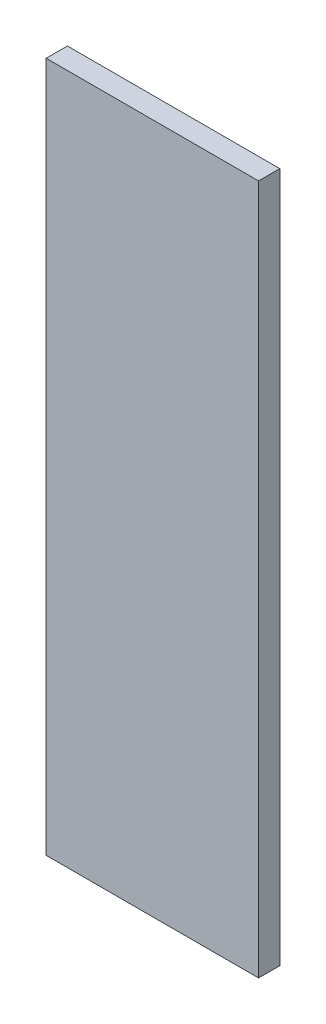
ISO-10303-21;
HEADER;
FILE_DESCRIPTION(('STEP AP214'),'2;1');
FILE_NAME('part.step','',(''),(''),'','','');
FILE_SCHEMA(('AUTOMOTIVE_DESIGN { 1 0 10303 214 1 1 1 1 }'));
ENDSEC;
DATA;
#1=APPLICATION_CONTEXT('core data for automotive mechanical design processes');
#2=APPLICATION_PROTOCOL_DEFINITION('international standard','automotive_design',2000,#1);
#3=PRODUCT_CONTEXT('',#1,'mechanical');
#4=PRODUCT('Part','Part','',(#3));
#5=PRODUCT_RELATED_PRODUCT_CATEGORY('part','',(#4));
#6=PRODUCT_DEFINITION_FORMATION('','',#4);
#7=PRODUCT_DEFINITION_CONTEXT('part definition',#1,'design');
#8=PRODUCT_DEFINITION('design','',#6,#7);
#9=PRODUCT_DEFINITION_SHAPE('','',#8);
#10=(LENGTH_UNIT() NAMED_UNIT(*) SI_UNIT(.MILLI.,.METRE.));
#11=(NAMED_UNIT(*) PLANE_ANGLE_UNIT() SI_UNIT($,.RADIAN.));
#12=(NAMED_UNIT(*) SI_UNIT($,.STERADIAN.) SOLID_ANGLE_UNIT());
#13=UNCERTAINTY_MEASURE_WITH_UNIT(LENGTH_MEASURE(1.E-05),#10,'distance_accuracy_value','');
#14=(GEOMETRIC_REPRESENTATION_CONTEXT(3) GLOBAL_UNCERTAINTY_ASSIGNED_CONTEXT((#13)) GLOBAL_UNIT_ASSIGNED_CONTEXT((#10,
#11,#12)) REPRESENTATION_CONTEXT('',''));
#15=CARTESIAN_POINT('',(0.,0.,0.));
#16=DIRECTION('',(0.,0.,1.));
#17=DIRECTION('',(1.,0.,0.));
#18=AXIS2_PLACEMENT_3D('',#15,#16,#17);
#19=CARTESIAN_POINT('',(40.,-130.,8.));
#20=DIRECTION('',(-1.,0.,0.));
#21=DIRECTION('',(0.,0.,1.));
#22=AXIS2_PLACEMENT_3D('',#19,#20,#21);
#23=PLANE('',#22);
#24=DIRECTION('',(0.,1.,0.));
#25=VECTOR('',#24,1.);
#26=CARTESIAN_POINT('',(40.,-130.,0.));
#27=LINE('',#26,#25);
#28=CARTESIAN_POINT('',(40.,-130.,0.));
#29=VERTEX_POINT('',#28);
#30=CARTESIAN_POINT('',(40.,130.,0.));
#31=VERTEX_POINT('',#30);
#32=EDGE_CURVE('E100',#29,#31,#27,.T.);
#33=ORIENTED_EDGE('',*,*,#32,.T.);
#34=DIRECTION('',(0.,0.,-1.));
#35=VECTOR('',#34,1.);
#36=CARTESIAN_POINT('',(40.,130.,8.));
#37=LINE('',#36,#35);
#38=CARTESIAN_POINT('',(40.,130.,8.));
#39=VERTEX_POINT('',#38);
#40=EDGE_CURVE('E11',#39,#31,#37,.T.);
#41=ORIENTED_EDGE('',*,*,#40,.F.);
#42=DIRECTION('',(0.,1.,0.));
#43=VECTOR('',#42,1.);
#44=CARTESIAN_POINT('',(40.,-130.,8.));
#45=LINE('',#44,#43);
#46=CARTESIAN_POINT('',(40.,-130.,8.));
#47=VERTEX_POINT('',#46);
#48=EDGE_CURVE('E88',#47,#39,#45,.T.);
#49=ORIENTED_EDGE('',*,*,#48,.F.);
#50=DIRECTION('',(0.,0.,-1.));
#51=VECTOR('',#50,1.);
#52=CARTESIAN_POINT('',(40.,-130.,8.));
#53=LINE('',#52,#51);
#54=EDGE_CURVE('E96',#47,#29,#53,.T.);
#55=ORIENTED_EDGE('',*,*,#54,.T.);
#56=EDGE_LOOP('',(#33,#41,#49,#55));
#57=FACE_BOUND('',#56,.T.);
#58=ADVANCED_FACE('F37',(#57),#23,.F.);
#59=CARTESIAN_POINT('',(-40.,130.,8.));
#60=DIRECTION('',(0.,-1.,0.));
#61=DIRECTION('',(0.,0.,-1.));
#62=AXIS2_PLACEMENT_3D('',#59,#60,#61);
#63=PLANE('',#62);
#64=DIRECTION('',(-1.,0.,0.));
#65=VECTOR('',#64,1.);
#66=CARTESIAN_POINT('',(-40.,130.,0.));
#67=LINE('',#66,#65);
#68=CARTESIAN_POINT('',(-40.,130.,0.));
#69=VERTEX_POINT('',#68);
#70=EDGE_CURVE('E92',#31,#69,#67,.T.);
#71=ORIENTED_EDGE('',*,*,#70,.T.);
#72=DIRECTION('',(0.,0.,-1.));
#73=VECTOR('',#72,1.);
#74=CARTESIAN_POINT('',(-40.,130.,8.));
#75=LINE('',#74,#73);
#76=CARTESIAN_POINT('',(-40.,130.,8.));
#77=VERTEX_POINT('',#76);
#78=EDGE_CURVE('E45',#77,#69,#75,.T.);
#79=ORIENTED_EDGE('',*,*,#78,.F.);
#80=DIRECTION('',(-1.,0.,0.));
#81=VECTOR('',#80,1.);
#82=CARTESIAN_POINT('',(-40.,130.,8.));
#83=LINE('',#82,#81);
#84=EDGE_CURVE('E83',#39,#77,#83,.T.);
#85=ORIENTED_EDGE('',*,*,#84,.F.);
#86=ORIENTED_EDGE('',*,*,#40,.T.);
#87=EDGE_LOOP('',(#71,#79,#85,#86));
#88=FACE_BOUND('',#87,.T.);
#89=ADVANCED_FACE('F91',(#88),#63,.F.);
#90=CARTESIAN_POINT('',(-40.,-130.,8.));
#91=DIRECTION('',(1.,0.,0.));
#92=DIRECTION('',(0.,0.,-1.));
#93=AXIS2_PLACEMENT_3D('',#90,#91,#92);
#94=PLANE('',#93);
#95=DIRECTION('',(0.,-1.,0.));
#96=VECTOR('',#95,1.);
#97=CARTESIAN_POINT('',(-40.,-130.,0.));
#98=LINE('',#97,#96);
#99=CARTESIAN_POINT('',(-40.,-130.,0.));
#100=VERTEX_POINT('',#99);
#101=EDGE_CURVE('E70',#69,#100,#98,.T.);
#102=ORIENTED_EDGE('',*,*,#101,.T.);
#103=DIRECTION('',(0.,0.,-1.));
#104=VECTOR('',#103,1.);
#105=CARTESIAN_POINT('',(-40.,-130.,8.));
#106=LINE('',#105,#104);
#107=CARTESIAN_POINT('',(-40.,-130.,8.));
#108=VERTEX_POINT('',#107);
#109=EDGE_CURVE('E93',#108,#100,#106,.T.);
#110=ORIENTED_EDGE('',*,*,#109,.F.);
#111=DIRECTION('',(0.,-1.,0.));
#112=VECTOR('',#111,1.);
#113=CARTESIAN_POINT('',(-40.,-130.,8.));
#114=LINE('',#113,#112);
#115=EDGE_CURVE('E86',#77,#108,#114,.T.);
#116=ORIENTED_EDGE('',*,*,#115,.F.);
#117=ORIENTED_EDGE('',*,*,#78,.T.);
#118=EDGE_LOOP('',(#102,#110,#116,#117));
#119=FACE_BOUND('',#118,.T.);
#120=ADVANCED_FACE('F94',(#119),#94,.F.);
#121=CARTESIAN_POINT('',(-40.,-130.,8.));
#122=DIRECTION('',(0.,1.,0.));
#123=DIRECTION('',(0.,0.,1.));
#124=AXIS2_PLACEMENT_3D('',#121,#122,#123);
#125=PLANE('',#124);
#126=DIRECTION('',(1.,0.,0.));
#127=VECTOR('',#126,1.);
#128=CARTESIAN_POINT('',(-40.,-130.,0.));
#129=LINE('',#128,#127);
#130=EDGE_CURVE('E76',#100,#29,#129,.T.);
#131=ORIENTED_EDGE('',*,*,#130,.T.);
#132=ORIENTED_EDGE('',*,*,#54,.F.);
#133=DIRECTION('',(1.,0.,0.));
#134=VECTOR('',#133,1.);
#135=CARTESIAN_POINT('',(-40.,-130.,8.));
#136=LINE('',#135,#134);
#137=EDGE_CURVE('E53',#108,#47,#136,.T.);
#138=ORIENTED_EDGE('',*,*,#137,.F.);
#139=ORIENTED_EDGE('',*,*,#109,.T.);
#140=EDGE_LOOP('',(#131,#132,#138,#139));
#141=FACE_BOUND('',#140,.T.);
#142=ADVANCED_FACE('F107',(#141),#125,.F.);
#143=CARTESIAN_POINT('',(0.,0.,8.));
#144=DIRECTION('',(0.,0.,-1.));
#145=DIRECTION('',(-1.,0.,0.));
#146=AXIS2_PLACEMENT_3D('',#143,#144,#145);
#147=PLANE('',#146);
#148=ORIENTED_EDGE('',*,*,#48,.T.);
#149=ORIENTED_EDGE('',*,*,#84,.T.);
#150=ORIENTED_EDGE('',*,*,#115,.T.);
#151=ORIENTED_EDGE('',*,*,#137,.T.);
#152=EDGE_LOOP('',(#148,#149,#150,#151));
#153=FACE_BOUND('',#152,.T.);
#154=ADVANCED_FACE('F84',(#153),#147,.F.);
#155=CARTESIAN_POINT('',(0.,0.,0.));
#156=DIRECTION('',(0.,0.,-1.));
#157=DIRECTION('',(-1.,0.,0.));
#158=AXIS2_PLACEMENT_3D('',#155,#156,#157);
#159=PLANE('',#158);
#160=ORIENTED_EDGE('',*,*,#32,.F.);
#161=ORIENTED_EDGE('',*,*,#130,.F.);
#162=ORIENTED_EDGE('',*,*,#101,.F.);
#163=ORIENTED_EDGE('',*,*,#70,.F.);
#164=EDGE_LOOP('',(#160,#161,#162,#163));
#165=FACE_BOUND('',#164,.T.);
#166=ADVANCED_FACE('F110',(#165),#159,.T.);
#167=CLOSED_SHELL('',(#58,#89,#120,#142,#154,#166));
#168=MANIFOLD_SOLID_BREP('B2',#167);
#169=ADVANCED_BREP_SHAPE_REPRESENTATION('',(#18,#168),#14);
#170=SHAPE_DEFINITION_REPRESENTATION(#9,#169);
ENDSEC;
END-ISO-10303-21;
